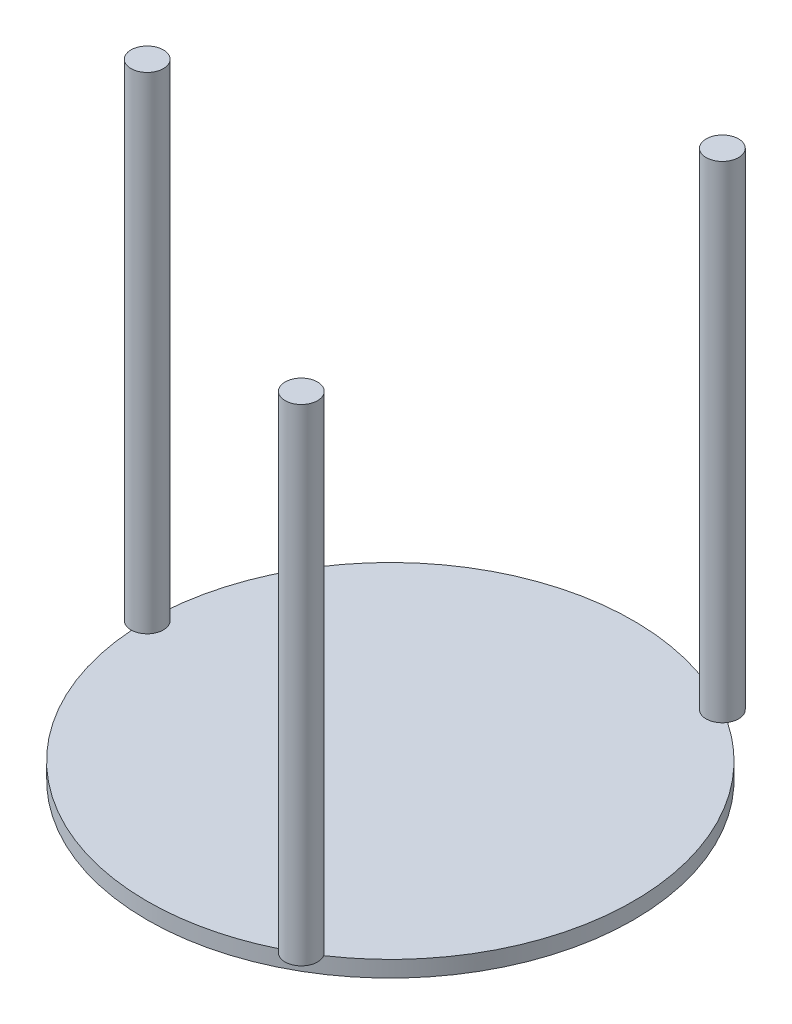
ISO-10303-21;
HEADER;
FILE_DESCRIPTION(('STEP AP214'),'2;1');
FILE_NAME('part.step','',(''),(''),'','','');
FILE_SCHEMA(('AUTOMOTIVE_DESIGN { 1 0 10303 214 1 1 1 1 }'));
ENDSEC;
DATA;
#1=APPLICATION_CONTEXT('core data for automotive mechanical design processes');
#2=APPLICATION_PROTOCOL_DEFINITION('international standard','automotive_design',2000,#1);
#3=PRODUCT_CONTEXT('',#1,'mechanical');
#4=PRODUCT('Part','Part','',(#3));
#5=PRODUCT_RELATED_PRODUCT_CATEGORY('part','',(#4));
#6=PRODUCT_DEFINITION_FORMATION('','',#4);
#7=PRODUCT_DEFINITION_CONTEXT('part definition',#1,'design');
#8=PRODUCT_DEFINITION('design','',#6,#7);
#9=PRODUCT_DEFINITION_SHAPE('','',#8);
#10=(LENGTH_UNIT() NAMED_UNIT(*) SI_UNIT(.MILLI.,.METRE.));
#11=(NAMED_UNIT(*) PLANE_ANGLE_UNIT() SI_UNIT($,.RADIAN.));
#12=(NAMED_UNIT(*) SI_UNIT($,.STERADIAN.) SOLID_ANGLE_UNIT());
#13=UNCERTAINTY_MEASURE_WITH_UNIT(LENGTH_MEASURE(1.E-05),#10,'distance_accuracy_value','');
#14=(GEOMETRIC_REPRESENTATION_CONTEXT(3) GLOBAL_UNCERTAINTY_ASSIGNED_CONTEXT((#13)) GLOBAL_UNIT_ASSIGNED_CONTEXT((#10,
#11,#12)) REPRESENTATION_CONTEXT('',''));
#15=CARTESIAN_POINT('',(0.,0.,0.));
#16=DIRECTION('',(0.,0.,1.));
#17=DIRECTION('',(1.,0.,0.));
#18=AXIS2_PLACEMENT_3D('',#15,#16,#17);
#19=CARTESIAN_POINT('',(-150.,300.,0.));
#20=DIRECTION('',(0.,-1.,0.));
#21=DIRECTION('',(0.,0.,-1.));
#22=AXIS2_PLACEMENT_3D('',#19,#20,#21);
#23=CYLINDRICAL_SURFACE('',#22,10.);
#24=CARTESIAN_POINT('',(-150.,300.,0.));
#25=DIRECTION('',(0.,1.,0.));
#26=DIRECTION('',(0.,0.,1.));
#27=AXIS2_PLACEMENT_3D('',#24,#25,#26);
#28=CIRCLE('',#27,10.);
#29=CARTESIAN_POINT('',(-150.,300.,10.));
#30=VERTEX_POINT('',#29);
#31=EDGE_CURVE('E11',#30,#30,#28,.T.);
#32=ORIENTED_EDGE('',*,*,#31,.F.);
#33=EDGE_LOOP('',(#32));
#34=FACE_BOUND('',#33,.T.);
#35=CARTESIAN_POINT('',(-150.,0.,0.));
#36=DIRECTION('',(0.,1.,0.));
#37=DIRECTION('',(0.,0.,1.));
#38=AXIS2_PLACEMENT_3D('',#35,#36,#37);
#39=CIRCLE('',#38,10.);
#40=CARTESIAN_POINT('',(-149.666666666667,0.,9.99444290037664));
#41=VERTEX_POINT('',#40);
#42=CARTESIAN_POINT('',(-149.666666666667,0.,-9.99444290037664));
#43=VERTEX_POINT('',#42);
#44=EDGE_CURVE('E35',#41,#43,#39,.T.);
#45=ORIENTED_EDGE('',*,*,#44,.T.);
#46=EDGE_CURVE('E98',#43,#41,#39,.T.);
#47=ORIENTED_EDGE('',*,*,#46,.T.);
#48=EDGE_LOOP('',(#45,#47));
#49=FACE_BOUND('',#48,.T.);
#50=ADVANCED_FACE('F32',(#34,#49),#23,.T.);
#51=CARTESIAN_POINT('',(-150.,300.,0.));
#52=DIRECTION('',(0.,1.,0.));
#53=DIRECTION('',(0.,0.,1.));
#54=AXIS2_PLACEMENT_3D('',#51,#52,#53);
#55=PLANE('',#54);
#56=ORIENTED_EDGE('',*,*,#31,.T.);
#57=EDGE_LOOP('',(#56));
#58=FACE_BOUND('',#57,.T.);
#59=ADVANCED_FACE('F109',(#58),#55,.T.);
#60=CARTESIAN_POINT('',(-150.,0.,0.));
#61=DIRECTION('',(0.,1.,0.));
#62=DIRECTION('',(0.,0.,1.));
#63=AXIS2_PLACEMENT_3D('',#60,#61,#62);
#64=PLANE('',#63);
#65=ORIENTED_EDGE('',*,*,#46,.F.);
#66=CARTESIAN_POINT('',(0.,0.,0.));
#67=DIRECTION('',(0.,1.,0.));
#68=DIRECTION('',(0.,0.,1.));
#69=AXIS2_PLACEMENT_3D('',#66,#67,#68);
#70=CIRCLE('',#69,150.);
#71=EDGE_CURVE('E70',#43,#41,#70,.T.);
#72=ORIENTED_EDGE('',*,*,#71,.T.);
#73=EDGE_LOOP('',(#65,#72));
#74=FACE_BOUND('',#73,.T.);
#75=ADVANCED_FACE('F106',(#74),#64,.F.);
#76=CARTESIAN_POINT('',(0.,0.,0.));
#77=DIRECTION('',(0.,1.,0.));
#78=DIRECTION('',(0.,0.,1.));
#79=AXIS2_PLACEMENT_3D('',#76,#77,#78);
#80=PLANE('',#79);
#81=CARTESIAN_POINT('',(66.1778918849329,0.,134.61235688326));
#82=VERTEX_POINT('',#81);
#83=EDGE_CURVE('E75',#41,#82,#70,.T.);
#84=ORIENTED_EDGE('',*,*,#83,.T.);
#85=CARTESIAN_POINT('',(74.9999999999988,0.,129.903810567666));
#86=DIRECTION('',(0.,1.,0.));
#87=DIRECTION('',(0.,0.,1.));
#88=AXIS2_PLACEMENT_3D('',#85,#86,#87);
#89=CIRCLE('',#88,10.);
#90=CARTESIAN_POINT('',(83.4887747817314,0.,124.617913982883));
#91=VERTEX_POINT('',#90);
#92=EDGE_CURVE('E72',#91,#82,#89,.T.);
#93=ORIENTED_EDGE('',*,*,#92,.F.);
#94=CARTESIAN_POINT('',(83.4887747817331,0.,-124.617913982882));
#95=VERTEX_POINT('',#94);
#96=EDGE_CURVE('E53',#91,#95,#70,.T.);
#97=ORIENTED_EDGE('',*,*,#96,.T.);
#98=CARTESIAN_POINT('',(75.0000000000006,0.,-129.903810567665));
#99=DIRECTION('',(0.,1.,0.));
#100=DIRECTION('',(0.,0.,1.));
#101=AXIS2_PLACEMENT_3D('',#98,#99,#100);
#102=CIRCLE('',#101,10.);
#103=CARTESIAN_POINT('',(66.1778918849347,0.,-134.612356883259));
#104=VERTEX_POINT('',#103);
#105=EDGE_CURVE('E93',#104,#95,#102,.T.);
#106=ORIENTED_EDGE('',*,*,#105,.F.);
#107=EDGE_CURVE('E84',#104,#43,#70,.T.);
#108=ORIENTED_EDGE('',*,*,#107,.T.);
#109=ORIENTED_EDGE('',*,*,#44,.F.);
#110=EDGE_LOOP('',(#84,#93,#97,#106,#108,#109));
#111=FACE_BOUND('',#110,.T.);
#112=ADVANCED_FACE('F73',(#111),#80,.T.);
#113=CARTESIAN_POINT('',(0.,-10.,0.));
#114=DIRECTION('',(0.,1.,0.));
#115=DIRECTION('',(0.,0.,1.));
#116=AXIS2_PLACEMENT_3D('',#113,#114,#115);
#117=CYLINDRICAL_SURFACE('',#116,150.);
#118=CARTESIAN_POINT('',(0.,-10.,0.));
#119=DIRECTION('',(0.,1.,0.));
#120=DIRECTION('',(0.,0.,1.));
#121=AXIS2_PLACEMENT_3D('',#118,#119,#120);
#122=CIRCLE('',#121,150.);
#123=CARTESIAN_POINT('',(0.,-10.,150.));
#124=VERTEX_POINT('',#123);
#125=EDGE_CURVE('E96',#124,#124,#122,.T.);
#126=ORIENTED_EDGE('',*,*,#125,.T.);
#127=EDGE_LOOP('',(#126));
#128=FACE_BOUND('',#127,.T.);
#129=ORIENTED_EDGE('',*,*,#71,.F.);
#130=ORIENTED_EDGE('',*,*,#107,.F.);
#131=EDGE_CURVE('E67',#95,#104,#70,.T.);
#132=ORIENTED_EDGE('',*,*,#131,.F.);
#133=ORIENTED_EDGE('',*,*,#96,.F.);
#134=EDGE_CURVE('E46',#82,#91,#70,.T.);
#135=ORIENTED_EDGE('',*,*,#134,.F.);
#136=ORIENTED_EDGE('',*,*,#83,.F.);
#137=EDGE_LOOP('',(#129,#130,#132,#133,#135,#136));
#138=FACE_BOUND('',#137,.T.);
#139=ADVANCED_FACE('F65',(#128,#138),#117,.T.);
#140=CARTESIAN_POINT('',(0.,-10.,0.));
#141=DIRECTION('',(0.,1.,0.));
#142=DIRECTION('',(0.,0.,1.));
#143=AXIS2_PLACEMENT_3D('',#140,#141,#142);
#144=PLANE('',#143);
#145=ORIENTED_EDGE('',*,*,#125,.F.);
#146=EDGE_LOOP('',(#145));
#147=FACE_BOUND('',#146,.T.);
#148=ADVANCED_FACE('F123',(#147),#144,.F.);
#149=CARTESIAN_POINT('',(75.0000000000006,300.,-129.903810567665));
#150=DIRECTION('',(0.,-1.,0.));
#151=DIRECTION('',(0.,0.,-1.));
#152=AXIS2_PLACEMENT_3D('',#149,#150,#151);
#153=CYLINDRICAL_SURFACE('',#152,10.);
#154=CARTESIAN_POINT('',(75.0000000000006,300.,-129.903810567665));
#155=DIRECTION('',(0.,1.,0.));
#156=DIRECTION('',(0.,0.,1.));
#157=AXIS2_PLACEMENT_3D('',#154,#155,#156);
#158=CIRCLE('',#157,10.);
#159=CARTESIAN_POINT('',(75.0000000000006,300.,-119.903810567665));
#160=VERTEX_POINT('',#159);
#161=EDGE_CURVE('E79',#160,#160,#158,.T.);
#162=ORIENTED_EDGE('',*,*,#161,.F.);
#163=EDGE_LOOP('',(#162));
#164=FACE_BOUND('',#163,.T.);
#165=EDGE_CURVE('E90',#95,#104,#102,.T.);
#166=ORIENTED_EDGE('',*,*,#165,.T.);
#167=ORIENTED_EDGE('',*,*,#105,.T.);
#168=EDGE_LOOP('',(#166,#167));
#169=FACE_BOUND('',#168,.T.);
#170=ADVANCED_FACE('F129',(#164,#169),#153,.T.);
#171=CARTESIAN_POINT('',(75.0000000000006,300.,-129.903810567665));
#172=DIRECTION('',(0.,1.,0.));
#173=DIRECTION('',(0.,0.,1.));
#174=AXIS2_PLACEMENT_3D('',#171,#172,#173);
#175=PLANE('',#174);
#176=ORIENTED_EDGE('',*,*,#161,.T.);
#177=EDGE_LOOP('',(#176));
#178=FACE_BOUND('',#177,.T.);
#179=ADVANCED_FACE('F131',(#178),#175,.T.);
#180=CARTESIAN_POINT('',(75.0000000000006,0.,-129.903810567665));
#181=DIRECTION('',(0.,1.,0.));
#182=DIRECTION('',(0.,0.,1.));
#183=AXIS2_PLACEMENT_3D('',#180,#181,#182);
#184=PLANE('',#183);
#185=ORIENTED_EDGE('',*,*,#131,.T.);
#186=ORIENTED_EDGE('',*,*,#165,.F.);
#187=EDGE_LOOP('',(#185,#186));
#188=FACE_BOUND('',#187,.T.);
#189=ADVANCED_FACE('F134',(#188),#184,.F.);
#190=CARTESIAN_POINT('',(74.9999999999988,300.,129.903810567666));
#191=DIRECTION('',(0.,-1.,0.));
#192=DIRECTION('',(0.,0.,-1.));
#193=AXIS2_PLACEMENT_3D('',#190,#191,#192);
#194=CYLINDRICAL_SURFACE('',#193,10.);
#195=CARTESIAN_POINT('',(74.9999999999988,300.,129.903810567666));
#196=DIRECTION('',(0.,1.,0.));
#197=DIRECTION('',(0.,0.,1.));
#198=AXIS2_PLACEMENT_3D('',#195,#196,#197);
#199=CIRCLE('',#198,10.);
#200=CARTESIAN_POINT('',(74.9999999999988,300.,139.903810567666));
#201=VERTEX_POINT('',#200);
#202=EDGE_CURVE('E86',#201,#201,#199,.T.);
#203=ORIENTED_EDGE('',*,*,#202,.F.);
#204=EDGE_LOOP('',(#203));
#205=FACE_BOUND('',#204,.T.);
#206=ORIENTED_EDGE('',*,*,#92,.T.);
#207=EDGE_CURVE('E80',#82,#91,#89,.T.);
#208=ORIENTED_EDGE('',*,*,#207,.T.);
#209=EDGE_LOOP('',(#206,#208));
#210=FACE_BOUND('',#209,.T.);
#211=ADVANCED_FACE('F85',(#205,#210),#194,.T.);
#212=CARTESIAN_POINT('',(74.9999999999988,300.,129.903810567666));
#213=DIRECTION('',(0.,1.,0.));
#214=DIRECTION('',(0.,0.,1.));
#215=AXIS2_PLACEMENT_3D('',#212,#213,#214);
#216=PLANE('',#215);
#217=ORIENTED_EDGE('',*,*,#202,.T.);
#218=EDGE_LOOP('',(#217));
#219=FACE_BOUND('',#218,.T.);
#220=ADVANCED_FACE('F141',(#219),#216,.T.);
#221=CARTESIAN_POINT('',(74.9999999999988,0.,129.903810567666));
#222=DIRECTION('',(0.,1.,0.));
#223=DIRECTION('',(0.,0.,1.));
#224=AXIS2_PLACEMENT_3D('',#221,#222,#223);
#225=PLANE('',#224);
#226=ORIENTED_EDGE('',*,*,#134,.T.);
#227=ORIENTED_EDGE('',*,*,#207,.F.);
#228=EDGE_LOOP('',(#226,#227));
#229=FACE_BOUND('',#228,.T.);
#230=ADVANCED_FACE('F83',(#229),#225,.F.);
#231=CLOSED_SHELL('',(#50,#59,#75,#112,#139,#148,#170,#179,#189,#211,#220,#230));
#232=MANIFOLD_SOLID_BREP('B2',#231);
#233=ADVANCED_BREP_SHAPE_REPRESENTATION('',(#18,#232),#14);
#234=SHAPE_DEFINITION_REPRESENTATION(#9,#233);
ENDSEC;
END-ISO-10303-21;
